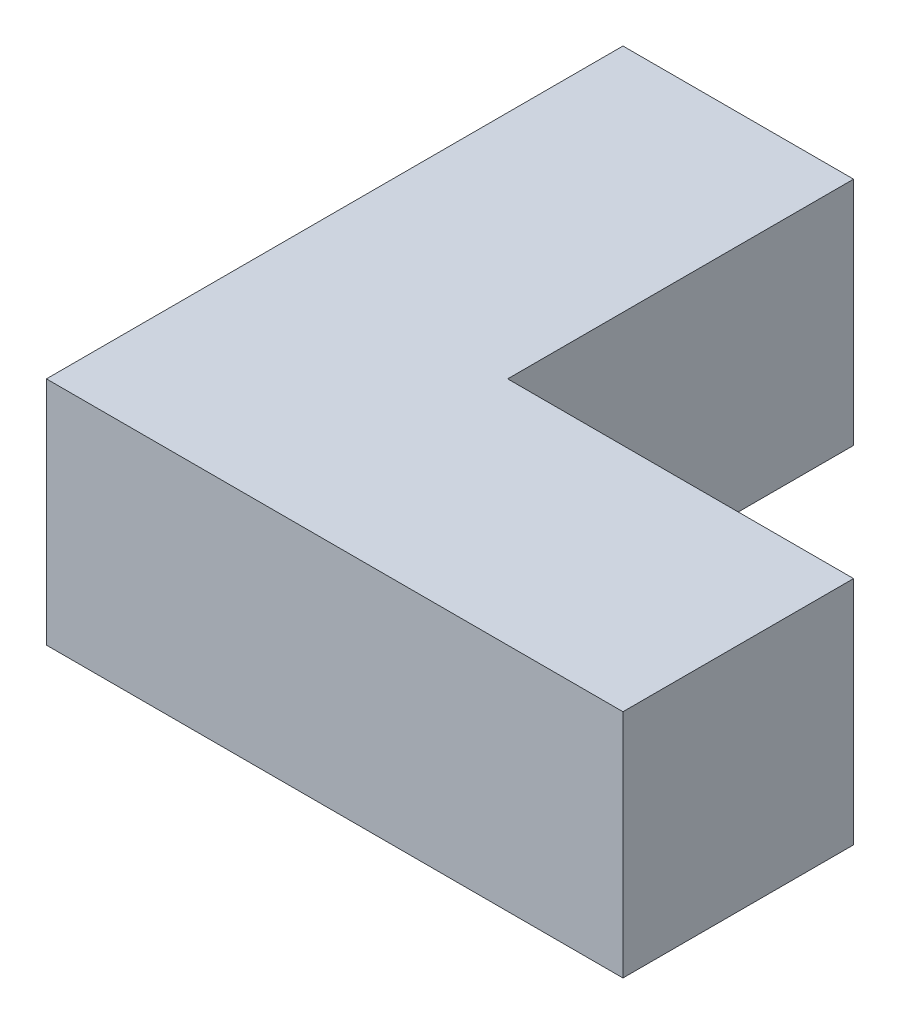
ISO-10303-21;
HEADER;
FILE_DESCRIPTION(('STEP AP214'),'2;1');
FILE_NAME('part.step','',(''),(''),'','','');
FILE_SCHEMA(('AUTOMOTIVE_DESIGN { 1 0 10303 214 1 1 1 1 }'));
ENDSEC;
DATA;
#1=APPLICATION_CONTEXT('core data for automotive mechanical design processes');
#2=APPLICATION_PROTOCOL_DEFINITION('international standard','automotive_design',2000,#1);
#3=PRODUCT_CONTEXT('',#1,'mechanical');
#4=PRODUCT('Part','Part','',(#3));
#5=PRODUCT_RELATED_PRODUCT_CATEGORY('part','',(#4));
#6=PRODUCT_DEFINITION_FORMATION('','',#4);
#7=PRODUCT_DEFINITION_CONTEXT('part definition',#1,'design');
#8=PRODUCT_DEFINITION('design','',#6,#7);
#9=PRODUCT_DEFINITION_SHAPE('','',#8);
#10=(LENGTH_UNIT() NAMED_UNIT(*) SI_UNIT(.MILLI.,.METRE.));
#11=(NAMED_UNIT(*) PLANE_ANGLE_UNIT() SI_UNIT($,.RADIAN.));
#12=(NAMED_UNIT(*) SI_UNIT($,.STERADIAN.) SOLID_ANGLE_UNIT());
#13=UNCERTAINTY_MEASURE_WITH_UNIT(LENGTH_MEASURE(1.E-05),#10,'distance_accuracy_value','');
#14=(GEOMETRIC_REPRESENTATION_CONTEXT(3) GLOBAL_UNCERTAINTY_ASSIGNED_CONTEXT((#13)) GLOBAL_UNIT_ASSIGNED_CONTEXT((#10,
#11,#12)) REPRESENTATION_CONTEXT('',''));
#15=CARTESIAN_POINT('',(0.,0.,0.));
#16=DIRECTION('',(0.,0.,1.));
#17=DIRECTION('',(1.,0.,0.));
#18=AXIS2_PLACEMENT_3D('',#15,#16,#17);
#19=CARTESIAN_POINT('',(0.,-10.,-10.));
#20=DIRECTION('',(0.,0.,1.));
#21=DIRECTION('',(1.,0.,0.));
#22=AXIS2_PLACEMENT_3D('',#19,#20,#21);
#23=PLANE('',#22);
#24=DIRECTION('',(1.,0.,0.));
#25=VECTOR('',#24,1.);
#26=CARTESIAN_POINT('',(0.,0.,-10.));
#27=LINE('',#26,#25);
#28=CARTESIAN_POINT('',(10.,0.,-10.));
#29=VERTEX_POINT('',#28);
#30=CARTESIAN_POINT('',(25.,0.,-10.));
#31=VERTEX_POINT('',#30);
#32=EDGE_CURVE('E117',#29,#31,#27,.T.);
#33=ORIENTED_EDGE('',*,*,#32,.T.);
#34=DIRECTION('',(0.,1.,0.));
#35=VECTOR('',#34,1.);
#36=CARTESIAN_POINT('',(25.,-10.,-10.));
#37=LINE('',#36,#35);
#38=CARTESIAN_POINT('',(25.,-10.,-10.));
#39=VERTEX_POINT('',#38);
#40=EDGE_CURVE('E11',#39,#31,#37,.T.);
#41=ORIENTED_EDGE('',*,*,#40,.F.);
#42=DIRECTION('',(1.,0.,0.));
#43=VECTOR('',#42,1.);
#44=CARTESIAN_POINT('',(0.,-10.,-10.));
#45=LINE('',#44,#43);
#46=CARTESIAN_POINT('',(10.,-10.,-10.));
#47=VERTEX_POINT('',#46);
#48=EDGE_CURVE('E53',#47,#39,#45,.T.);
#49=ORIENTED_EDGE('',*,*,#48,.F.);
#50=DIRECTION('',(0.,1.,0.));
#51=VECTOR('',#50,1.);
#52=CARTESIAN_POINT('',(10.,-10.,-10.));
#53=LINE('',#52,#51);
#54=EDGE_CURVE('E38',#47,#29,#53,.T.);
#55=ORIENTED_EDGE('',*,*,#54,.T.);
#56=EDGE_LOOP('',(#33,#41,#49,#55));
#57=FACE_BOUND('',#56,.T.);
#58=ADVANCED_FACE('F35',(#57),#23,.F.);
#59=CARTESIAN_POINT('',(25.,-10.,0.));
#60=DIRECTION('',(1.,0.,0.));
#61=DIRECTION('',(0.,0.,-1.));
#62=AXIS2_PLACEMENT_3D('',#59,#60,#61);
#63=PLANE('',#62);
#64=DIRECTION('',(0.,0.,-1.));
#65=VECTOR('',#64,1.);
#66=CARTESIAN_POINT('',(25.,0.,0.));
#67=LINE('',#66,#65);
#68=CARTESIAN_POINT('',(25.,0.,0.));
#69=VERTEX_POINT('',#68);
#70=EDGE_CURVE('E128',#69,#31,#67,.T.);
#71=ORIENTED_EDGE('',*,*,#70,.F.);
#72=DIRECTION('',(0.,1.,0.));
#73=VECTOR('',#72,1.);
#74=CARTESIAN_POINT('',(25.,-10.,0.));
#75=LINE('',#74,#73);
#76=CARTESIAN_POINT('',(25.,-10.,0.));
#77=VERTEX_POINT('',#76);
#78=EDGE_CURVE('E44',#77,#69,#75,.T.);
#79=ORIENTED_EDGE('',*,*,#78,.F.);
#80=DIRECTION('',(0.,0.,-1.));
#81=VECTOR('',#80,1.);
#82=CARTESIAN_POINT('',(25.,-10.,0.));
#83=LINE('',#82,#81);
#84=EDGE_CURVE('E112',#77,#39,#83,.T.);
#85=ORIENTED_EDGE('',*,*,#84,.T.);
#86=ORIENTED_EDGE('',*,*,#40,.T.);
#87=EDGE_LOOP('',(#71,#79,#85,#86));
#88=FACE_BOUND('',#87,.T.);
#89=ADVANCED_FACE('F150',(#88),#63,.T.);
#90=CARTESIAN_POINT('',(0.,-10.,0.));
#91=DIRECTION('',(0.,0.,1.));
#92=DIRECTION('',(1.,0.,0.));
#93=AXIS2_PLACEMENT_3D('',#90,#91,#92);
#94=PLANE('',#93);
#95=DIRECTION('',(1.,0.,0.));
#96=VECTOR('',#95,1.);
#97=CARTESIAN_POINT('',(0.,0.,0.));
#98=LINE('',#97,#96);
#99=CARTESIAN_POINT('',(0.,0.,0.));
#100=VERTEX_POINT('',#99);
#101=EDGE_CURVE('E99',#100,#69,#98,.T.);
#102=ORIENTED_EDGE('',*,*,#101,.F.);
#103=DIRECTION('',(0.,1.,0.));
#104=VECTOR('',#103,1.);
#105=CARTESIAN_POINT('',(0.,-10.,0.));
#106=LINE('',#105,#104);
#107=CARTESIAN_POINT('',(0.,-10.,0.));
#108=VERTEX_POINT('',#107);
#109=EDGE_CURVE('E94',#108,#100,#106,.T.);
#110=ORIENTED_EDGE('',*,*,#109,.F.);
#111=DIRECTION('',(1.,0.,0.));
#112=VECTOR('',#111,1.);
#113=CARTESIAN_POINT('',(0.,-10.,0.));
#114=LINE('',#113,#112);
#115=EDGE_CURVE('E98',#108,#77,#114,.T.);
#116=ORIENTED_EDGE('',*,*,#115,.T.);
#117=ORIENTED_EDGE('',*,*,#78,.T.);
#118=EDGE_LOOP('',(#102,#110,#116,#117));
#119=FACE_BOUND('',#118,.T.);
#120=ADVANCED_FACE('F96',(#119),#94,.T.);
#121=CARTESIAN_POINT('',(0.,-10.,0.));
#122=DIRECTION('',(1.,0.,0.));
#123=DIRECTION('',(0.,0.,-1.));
#124=AXIS2_PLACEMENT_3D('',#121,#122,#123);
#125=PLANE('',#124);
#126=DIRECTION('',(0.,0.,-1.));
#127=VECTOR('',#126,1.);
#128=CARTESIAN_POINT('',(0.,0.,0.));
#129=LINE('',#128,#127);
#130=CARTESIAN_POINT('',(0.,0.,-25.));
#131=VERTEX_POINT('',#130);
#132=EDGE_CURVE('E125',#100,#131,#129,.T.);
#133=ORIENTED_EDGE('',*,*,#132,.T.);
#134=DIRECTION('',(0.,1.,0.));
#135=VECTOR('',#134,1.);
#136=CARTESIAN_POINT('',(0.,-10.,-25.));
#137=LINE('',#136,#135);
#138=CARTESIAN_POINT('',(0.,-10.,-25.));
#139=VERTEX_POINT('',#138);
#140=EDGE_CURVE('E102',#139,#131,#137,.T.);
#141=ORIENTED_EDGE('',*,*,#140,.F.);
#142=DIRECTION('',(0.,0.,-1.));
#143=VECTOR('',#142,1.);
#144=CARTESIAN_POINT('',(0.,-10.,0.));
#145=LINE('',#144,#143);
#146=EDGE_CURVE('E105',#108,#139,#145,.T.);
#147=ORIENTED_EDGE('',*,*,#146,.F.);
#148=ORIENTED_EDGE('',*,*,#109,.T.);
#149=EDGE_LOOP('',(#133,#141,#147,#148));
#150=FACE_BOUND('',#149,.T.);
#151=ADVANCED_FACE('F106',(#150),#125,.F.);
#152=CARTESIAN_POINT('',(0.,-10.,-25.));
#153=DIRECTION('',(0.,0.,1.));
#154=DIRECTION('',(1.,0.,0.));
#155=AXIS2_PLACEMENT_3D('',#152,#153,#154);
#156=PLANE('',#155);
#157=DIRECTION('',(1.,0.,0.));
#158=VECTOR('',#157,1.);
#159=CARTESIAN_POINT('',(0.,0.,-25.));
#160=LINE('',#159,#158);
#161=CARTESIAN_POINT('',(10.,0.,-25.));
#162=VERTEX_POINT('',#161);
#163=EDGE_CURVE('E122',#131,#162,#160,.T.);
#164=ORIENTED_EDGE('',*,*,#163,.T.);
#165=DIRECTION('',(0.,1.,0.));
#166=VECTOR('',#165,1.);
#167=CARTESIAN_POINT('',(10.,-10.,-25.));
#168=LINE('',#167,#166);
#169=CARTESIAN_POINT('',(10.,-10.,-25.));
#170=VERTEX_POINT('',#169);
#171=EDGE_CURVE('E132',#170,#162,#168,.T.);
#172=ORIENTED_EDGE('',*,*,#171,.F.);
#173=DIRECTION('',(1.,0.,0.));
#174=VECTOR('',#173,1.);
#175=CARTESIAN_POINT('',(0.,-10.,-25.));
#176=LINE('',#175,#174);
#177=EDGE_CURVE('E109',#139,#170,#176,.T.);
#178=ORIENTED_EDGE('',*,*,#177,.F.);
#179=ORIENTED_EDGE('',*,*,#140,.T.);
#180=EDGE_LOOP('',(#164,#172,#178,#179));
#181=FACE_BOUND('',#180,.T.);
#182=ADVANCED_FACE('F141',(#181),#156,.F.);
#183=CARTESIAN_POINT('',(10.,-10.,0.));
#184=DIRECTION('',(1.,0.,0.));
#185=DIRECTION('',(0.,0.,-1.));
#186=AXIS2_PLACEMENT_3D('',#183,#184,#185);
#187=PLANE('',#186);
#188=DIRECTION('',(0.,0.,-1.));
#189=VECTOR('',#188,1.);
#190=CARTESIAN_POINT('',(10.,0.,0.));
#191=LINE('',#190,#189);
#192=EDGE_CURVE('E119',#29,#162,#191,.T.);
#193=ORIENTED_EDGE('',*,*,#192,.F.);
#194=ORIENTED_EDGE('',*,*,#54,.F.);
#195=DIRECTION('',(0.,0.,-1.));
#196=VECTOR('',#195,1.);
#197=CARTESIAN_POINT('',(10.,-10.,0.));
#198=LINE('',#197,#196);
#199=EDGE_CURVE('E235',#47,#170,#198,.T.);
#200=ORIENTED_EDGE('',*,*,#199,.T.);
#201=ORIENTED_EDGE('',*,*,#171,.T.);
#202=EDGE_LOOP('',(#193,#194,#200,#201));
#203=FACE_BOUND('',#202,.T.);
#204=ADVANCED_FACE('F139',(#203),#187,.T.);
#205=CARTESIAN_POINT('',(0.,-10.,0.));
#206=DIRECTION('',(0.,1.,0.));
#207=DIRECTION('',(0.,0.,1.));
#208=AXIS2_PLACEMENT_3D('',#205,#206,#207);
#209=PLANE('',#208);
#210=ORIENTED_EDGE('',*,*,#48,.T.);
#211=ORIENTED_EDGE('',*,*,#84,.F.);
#212=ORIENTED_EDGE('',*,*,#115,.F.);
#213=ORIENTED_EDGE('',*,*,#146,.T.);
#214=ORIENTED_EDGE('',*,*,#177,.T.);
#215=ORIENTED_EDGE('',*,*,#199,.F.);
#216=EDGE_LOOP('',(#210,#211,#212,#213,#214,#215));
#217=FACE_BOUND('',#216,.T.);
#218=ADVANCED_FACE('F111',(#217),#209,.F.);
#219=CARTESIAN_POINT('',(0.,0.,0.));
#220=DIRECTION('',(0.,1.,0.));
#221=DIRECTION('',(0.,0.,1.));
#222=AXIS2_PLACEMENT_3D('',#219,#220,#221);
#223=PLANE('',#222);
#224=ORIENTED_EDGE('',*,*,#32,.F.);
#225=ORIENTED_EDGE('',*,*,#192,.T.);
#226=ORIENTED_EDGE('',*,*,#163,.F.);
#227=ORIENTED_EDGE('',*,*,#132,.F.);
#228=ORIENTED_EDGE('',*,*,#101,.T.);
#229=ORIENTED_EDGE('',*,*,#70,.T.);
#230=EDGE_LOOP('',(#224,#225,#226,#227,#228,#229));
#231=FACE_BOUND('',#230,.T.);
#232=ADVANCED_FACE('F137',(#231),#223,.T.);
#233=CLOSED_SHELL('',(#58,#89,#120,#151,#182,#204,#218,#232));
#234=MANIFOLD_SOLID_BREP('B2',#233);
#235=ADVANCED_BREP_SHAPE_REPRESENTATION('',(#18,#234),#14);
#236=SHAPE_DEFINITION_REPRESENTATION(#9,#235);
ENDSEC;
END-ISO-10303-21;
